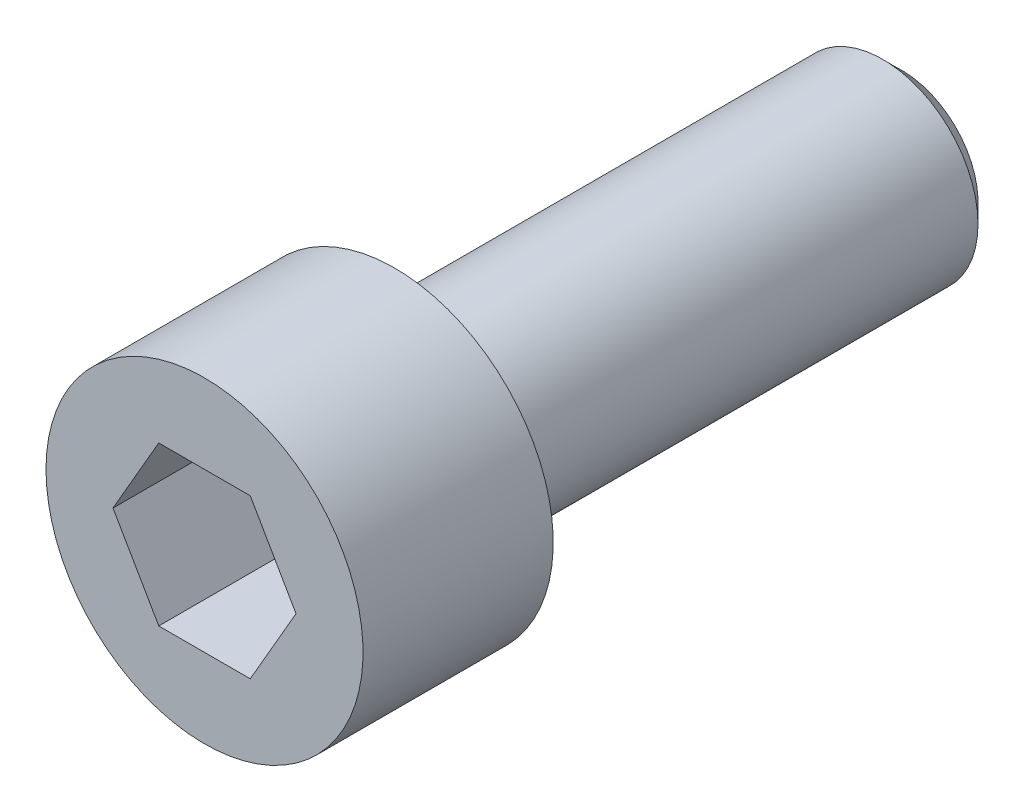
ISO-10303-21;
HEADER;
FILE_DESCRIPTION(('STEP AP214'),'2;1');
FILE_NAME('part.step','',(''),(''),'','','');
FILE_SCHEMA(('AUTOMOTIVE_DESIGN { 1 0 10303 214 1 1 1 1 }'));
ENDSEC;
DATA;
#1=APPLICATION_CONTEXT('core data for automotive mechanical design processes');
#2=APPLICATION_PROTOCOL_DEFINITION('international standard','automotive_design',2000,#1);
#3=PRODUCT_CONTEXT('',#1,'mechanical');
#4=PRODUCT('Part','Part','',(#3));
#5=PRODUCT_RELATED_PRODUCT_CATEGORY('part','',(#4));
#6=PRODUCT_DEFINITION_FORMATION('','',#4);
#7=PRODUCT_DEFINITION_CONTEXT('part definition',#1,'design');
#8=PRODUCT_DEFINITION('design','',#6,#7);
#9=PRODUCT_DEFINITION_SHAPE('','',#8);
#10=(LENGTH_UNIT() NAMED_UNIT(*) SI_UNIT(.MILLI.,.METRE.));
#11=(NAMED_UNIT(*) PLANE_ANGLE_UNIT() SI_UNIT($,.RADIAN.));
#12=(NAMED_UNIT(*) SI_UNIT($,.STERADIAN.) SOLID_ANGLE_UNIT());
#13=UNCERTAINTY_MEASURE_WITH_UNIT(LENGTH_MEASURE(1.E-05),#10,'distance_accuracy_value','');
#14=(GEOMETRIC_REPRESENTATION_CONTEXT(3) GLOBAL_UNCERTAINTY_ASSIGNED_CONTEXT((#13)) GLOBAL_UNIT_ASSIGNED_CONTEXT((#10,
#11,#12)) REPRESENTATION_CONTEXT('',''));
#15=CARTESIAN_POINT('',(0.,0.,0.));
#16=DIRECTION('',(0.,0.,1.));
#17=DIRECTION('',(1.,0.,0.));
#18=AXIS2_PLACEMENT_3D('',#15,#16,#17);
#19=CARTESIAN_POINT('',(0.,0.,0.));
#20=DIRECTION('',(0.,0.,1.));
#21=DIRECTION('',(1.,0.,0.));
#22=AXIS2_PLACEMENT_3D('',#19,#20,#21);
#23=PLANE('',#22);
#24=DIRECTION('',(0.5,0.866025403784439,0.));
#25=VECTOR('',#24,1.);
#26=CARTESIAN_POINT('',(0.721687836487033,-1.25,0.));
#27=LINE('',#26,#25);
#28=CARTESIAN_POINT('',(0.721687836487033,-1.25,0.));
#29=VERTEX_POINT('',#28);
#30=CARTESIAN_POINT('',(1.44337567297407,0.,0.));
#31=VERTEX_POINT('',#30);
#32=EDGE_CURVE('E50',#29,#31,#27,.T.);
#33=ORIENTED_EDGE('',*,*,#32,.F.);
#34=DIRECTION('',(1.,0.,0.));
#35=VECTOR('',#34,1.);
#36=CARTESIAN_POINT('',(-0.721687836487032,-1.25,0.));
#37=LINE('',#36,#35);
#38=CARTESIAN_POINT('',(-0.721687836487032,-1.25,0.));
#39=VERTEX_POINT('',#38);
#40=EDGE_CURVE('E133',#39,#29,#37,.T.);
#41=ORIENTED_EDGE('',*,*,#40,.F.);
#42=DIRECTION('',(0.5,-0.866025403784439,0.));
#43=VECTOR('',#42,1.);
#44=CARTESIAN_POINT('',(-1.44337567297406,0.,0.));
#45=LINE('',#44,#43);
#46=CARTESIAN_POINT('',(-1.44337567297406,0.,0.));
#47=VERTEX_POINT('',#46);
#48=EDGE_CURVE('E131',#47,#39,#45,.T.);
#49=ORIENTED_EDGE('',*,*,#48,.F.);
#50=DIRECTION('',(-0.5,-0.866025403784439,0.));
#51=VECTOR('',#50,1.);
#52=CARTESIAN_POINT('',(-0.721687836487032,1.25,0.));
#53=LINE('',#52,#51);
#54=CARTESIAN_POINT('',(-0.721687836487032,1.25,0.));
#55=VERTEX_POINT('',#54);
#56=EDGE_CURVE('E98',#55,#47,#53,.T.);
#57=ORIENTED_EDGE('',*,*,#56,.F.);
#58=DIRECTION('',(-1.,0.,0.));
#59=VECTOR('',#58,1.);
#60=CARTESIAN_POINT('',(0.721687836487032,1.25,0.));
#61=LINE('',#60,#59);
#62=CARTESIAN_POINT('',(0.721687836487032,1.25,0.));
#63=VERTEX_POINT('',#62);
#64=EDGE_CURVE('E127',#63,#55,#61,.T.);
#65=ORIENTED_EDGE('',*,*,#64,.F.);
#66=DIRECTION('',(-0.5,0.866025403784438,0.));
#67=VECTOR('',#66,1.);
#68=CARTESIAN_POINT('',(1.44337567297407,0.,0.));
#69=LINE('',#68,#67);
#70=EDGE_CURVE('E124',#31,#63,#69,.T.);
#71=ORIENTED_EDGE('',*,*,#70,.F.);
#72=EDGE_LOOP('',(#33,#41,#49,#57,#65,#71));
#73=FACE_BOUND('',#72,.T.);
#74=CARTESIAN_POINT('',(0.,0.,0.));
#75=DIRECTION('',(0.,0.,-1.));
#76=DIRECTION('',(-1.,0.,0.));
#77=AXIS2_PLACEMENT_3D('',#74,#75,#76);
#78=CIRCLE('',#77,2.5);
#79=CARTESIAN_POINT('',(-2.5,0.,0.));
#80=VERTEX_POINT('',#79);
#81=EDGE_CURVE('E145',#80,#80,#78,.T.);
#82=ORIENTED_EDGE('',*,*,#81,.F.);
#83=EDGE_LOOP('',(#82));
#84=FACE_BOUND('',#83,.T.);
#85=ADVANCED_FACE('F35',(#73,#84),#23,.T.);
#86=CARTESIAN_POINT('',(0.,0.,0.));
#87=DIRECTION('',(0.,0.,-1.));
#88=DIRECTION('',(-1.,0.,0.));
#89=AXIS2_PLACEMENT_3D('',#86,#87,#88);
#90=CYLINDRICAL_SURFACE('',#89,2.5);
#91=ORIENTED_EDGE('',*,*,#81,.T.);
#92=EDGE_LOOP('',(#91));
#93=FACE_BOUND('',#92,.T.);
#94=CARTESIAN_POINT('',(0.,0.,-3.));
#95=DIRECTION('',(0.,0.,-1.));
#96=DIRECTION('',(-1.,0.,0.));
#97=AXIS2_PLACEMENT_3D('',#94,#95,#96);
#98=CIRCLE('',#97,2.5);
#99=CARTESIAN_POINT('',(-2.5,0.,-3.));
#100=VERTEX_POINT('',#99);
#101=EDGE_CURVE('E137',#100,#100,#98,.T.);
#102=ORIENTED_EDGE('',*,*,#101,.F.);
#103=EDGE_LOOP('',(#102));
#104=FACE_BOUND('',#103,.T.);
#105=ADVANCED_FACE('F167',(#93,#104),#90,.T.);
#106=CARTESIAN_POINT('',(0.,2.5,-3.));
#107=DIRECTION('',(0.,0.,-1.));
#108=DIRECTION('',(-1.,0.,0.));
#109=AXIS2_PLACEMENT_3D('',#106,#107,#108);
#110=PLANE('',#109);
#111=CARTESIAN_POINT('',(0.,0.,-3.));
#112=DIRECTION('',(0.,0.,-1.));
#113=DIRECTION('',(-1.,0.,0.));
#114=AXIS2_PLACEMENT_3D('',#111,#112,#113);
#115=CIRCLE('',#114,1.8);
#116=CARTESIAN_POINT('',(-1.8,0.,-3.));
#117=VERTEX_POINT('',#116);
#118=EDGE_CURVE('E151',#117,#117,#115,.F.);
#119=ORIENTED_EDGE('',*,*,#118,.T.);
#120=EDGE_LOOP('',(#119));
#121=FACE_BOUND('',#120,.T.);
#122=ORIENTED_EDGE('',*,*,#101,.T.);
#123=EDGE_LOOP('',(#122));
#124=FACE_BOUND('',#123,.T.);
#125=ADVANCED_FACE('F173',(#121,#124),#110,.T.);
#126=CARTESIAN_POINT('',(0.,0.,0.));
#127=DIRECTION('',(0.,0.,-1.));
#128=DIRECTION('',(-1.,0.,0.));
#129=AXIS2_PLACEMENT_3D('',#126,#127,#128);
#130=CYLINDRICAL_SURFACE('',#129,1.5);
#131=CARTESIAN_POINT('',(0.,0.,-10.7));
#132=DIRECTION('',(0.,0.,-1.));
#133=DIRECTION('',(-1.,0.,0.));
#134=AXIS2_PLACEMENT_3D('',#131,#132,#133);
#135=CIRCLE('',#134,1.5);
#136=CARTESIAN_POINT('',(-1.5,0.,-10.7));
#137=VERTEX_POINT('',#136);
#138=EDGE_CURVE('E11',#137,#137,#135,.F.);
#139=ORIENTED_EDGE('',*,*,#138,.T.);
#140=EDGE_LOOP('',(#139));
#141=FACE_BOUND('',#140,.T.);
#142=CARTESIAN_POINT('',(0.,0.,-3.3));
#143=DIRECTION('',(0.,0.,-1.));
#144=DIRECTION('',(-1.,0.,0.));
#145=AXIS2_PLACEMENT_3D('',#142,#143,#144);
#146=CIRCLE('',#145,1.5);
#147=CARTESIAN_POINT('',(-1.5,0.,-3.3));
#148=VERTEX_POINT('',#147);
#149=EDGE_CURVE('E148',#148,#148,#146,.T.);
#150=ORIENTED_EDGE('',*,*,#149,.T.);
#151=EDGE_LOOP('',(#150));
#152=FACE_BOUND('',#151,.T.);
#153=ADVANCED_FACE('F180',(#141,#152),#130,.T.);
#154=CARTESIAN_POINT('',(0.,1.5,-11.));
#155=DIRECTION('',(0.,0.,-1.));
#156=DIRECTION('',(-1.,0.,0.));
#157=AXIS2_PLACEMENT_3D('',#154,#155,#156);
#158=PLANE('',#157);
#159=CARTESIAN_POINT('',(0.,0.,-11.));
#160=DIRECTION('',(0.,0.,-1.));
#161=DIRECTION('',(-1.,0.,0.));
#162=AXIS2_PLACEMENT_3D('',#159,#160,#161);
#163=CIRCLE('',#162,1.2);
#164=CARTESIAN_POINT('',(-1.2,0.,-11.));
#165=VERTEX_POINT('',#164);
#166=EDGE_CURVE('E43',#165,#165,#163,.T.);
#167=ORIENTED_EDGE('',*,*,#166,.T.);
#168=EDGE_LOOP('',(#167));
#169=FACE_BOUND('',#168,.T.);
#170=ADVANCED_FACE('F156',(#169),#158,.T.);
#171=CARTESIAN_POINT('',(0.721687836487033,-1.25,-2.));
#172=DIRECTION('',(0.866025403784439,-0.5,0.));
#173=DIRECTION('',(0.5,0.866025403784439,0.));
#174=AXIS2_PLACEMENT_3D('',#171,#172,#173);
#175=PLANE('',#174);
#176=ORIENTED_EDGE('',*,*,#32,.T.);
#177=DIRECTION('',(0.,0.,1.));
#178=VECTOR('',#177,1.);
#179=CARTESIAN_POINT('',(1.44337567297407,0.,-2.));
#180=LINE('',#179,#178);
#181=CARTESIAN_POINT('',(1.44337567297407,0.,-2.));
#182=VERTEX_POINT('',#181);
#183=EDGE_CURVE('E80',#182,#31,#180,.T.);
#184=ORIENTED_EDGE('',*,*,#183,.F.);
#185=DIRECTION('',(0.5,0.866025403784439,0.));
#186=VECTOR('',#185,1.);
#187=CARTESIAN_POINT('',(0.721687836487033,-1.25,-2.));
#188=LINE('',#187,#186);
#189=CARTESIAN_POINT('',(0.721687836487033,-1.25,-2.));
#190=VERTEX_POINT('',#189);
#191=EDGE_CURVE('E135',#190,#182,#188,.T.);
#192=ORIENTED_EDGE('',*,*,#191,.F.);
#193=DIRECTION('',(0.,0.,1.));
#194=VECTOR('',#193,1.);
#195=CARTESIAN_POINT('',(0.721687836487033,-1.25,-2.));
#196=LINE('',#195,#194);
#197=EDGE_CURVE('E58',#190,#29,#196,.T.);
#198=ORIENTED_EDGE('',*,*,#197,.T.);
#199=EDGE_LOOP('',(#176,#184,#192,#198));
#200=FACE_BOUND('',#199,.T.);
#201=ADVANCED_FACE('F187',(#200),#175,.F.);
#202=CARTESIAN_POINT('',(-0.721687836487032,-1.25,-2.));
#203=DIRECTION('',(0.,-1.,0.));
#204=DIRECTION('',(0.,0.,-1.));
#205=AXIS2_PLACEMENT_3D('',#202,#203,#204);
#206=PLANE('',#205);
#207=ORIENTED_EDGE('',*,*,#40,.T.);
#208=ORIENTED_EDGE('',*,*,#197,.F.);
#209=DIRECTION('',(1.,0.,0.));
#210=VECTOR('',#209,1.);
#211=CARTESIAN_POINT('',(-0.721687836487032,-1.25,-2.));
#212=LINE('',#211,#210);
#213=CARTESIAN_POINT('',(-0.721687836487032,-1.25,-2.));
#214=VERTEX_POINT('',#213);
#215=EDGE_CURVE('E110',#214,#190,#212,.T.);
#216=ORIENTED_EDGE('',*,*,#215,.F.);
#217=DIRECTION('',(0.,0.,1.));
#218=VECTOR('',#217,1.);
#219=CARTESIAN_POINT('',(-0.721687836487032,-1.25,-2.));
#220=LINE('',#219,#218);
#221=EDGE_CURVE('E102',#214,#39,#220,.T.);
#222=ORIENTED_EDGE('',*,*,#221,.T.);
#223=EDGE_LOOP('',(#207,#208,#216,#222));
#224=FACE_BOUND('',#223,.T.);
#225=ADVANCED_FACE('F190',(#224),#206,.F.);
#226=CARTESIAN_POINT('',(-1.44337567297406,0.,-2.));
#227=DIRECTION('',(-0.866025403784439,-0.5,0.));
#228=DIRECTION('',(0.5,-0.866025403784439,0.));
#229=AXIS2_PLACEMENT_3D('',#226,#227,#228);
#230=PLANE('',#229);
#231=ORIENTED_EDGE('',*,*,#48,.T.);
#232=ORIENTED_EDGE('',*,*,#221,.F.);
#233=DIRECTION('',(0.5,-0.866025403784439,0.));
#234=VECTOR('',#233,1.);
#235=CARTESIAN_POINT('',(-1.44337567297406,0.,-2.));
#236=LINE('',#235,#234);
#237=CARTESIAN_POINT('',(-1.44337567297406,0.,-2.));
#238=VERTEX_POINT('',#237);
#239=EDGE_CURVE('E106',#238,#214,#236,.T.);
#240=ORIENTED_EDGE('',*,*,#239,.F.);
#241=DIRECTION('',(0.,0.,1.));
#242=VECTOR('',#241,1.);
#243=CARTESIAN_POINT('',(-1.44337567297406,0.,-2.));
#244=LINE('',#243,#242);
#245=EDGE_CURVE('E91',#238,#47,#244,.T.);
#246=ORIENTED_EDGE('',*,*,#245,.T.);
#247=EDGE_LOOP('',(#231,#232,#240,#246));
#248=FACE_BOUND('',#247,.T.);
#249=ADVANCED_FACE('F107',(#248),#230,.F.);
#250=CARTESIAN_POINT('',(-0.721687836487032,1.25,-2.));
#251=DIRECTION('',(-0.866025403784439,0.5,0.));
#252=DIRECTION('',(-0.5,-0.866025403784439,0.));
#253=AXIS2_PLACEMENT_3D('',#250,#251,#252);
#254=PLANE('',#253);
#255=ORIENTED_EDGE('',*,*,#56,.T.);
#256=ORIENTED_EDGE('',*,*,#245,.F.);
#257=DIRECTION('',(-0.5,-0.866025403784439,0.));
#258=VECTOR('',#257,1.);
#259=CARTESIAN_POINT('',(-0.721687836487032,1.25,-2.));
#260=LINE('',#259,#258);
#261=CARTESIAN_POINT('',(-0.721687836487032,1.25,-2.));
#262=VERTEX_POINT('',#261);
#263=EDGE_CURVE('E95',#262,#238,#260,.T.);
#264=ORIENTED_EDGE('',*,*,#263,.F.);
#265=DIRECTION('',(0.,0.,1.));
#266=VECTOR('',#265,1.);
#267=CARTESIAN_POINT('',(-0.721687836487032,1.25,-2.));
#268=LINE('',#267,#266);
#269=EDGE_CURVE('E103',#262,#55,#268,.T.);
#270=ORIENTED_EDGE('',*,*,#269,.T.);
#271=EDGE_LOOP('',(#255,#256,#264,#270));
#272=FACE_BOUND('',#271,.T.);
#273=ADVANCED_FACE('F93',(#272),#254,.F.);
#274=CARTESIAN_POINT('',(0.721687836487032,1.25,-2.));
#275=DIRECTION('',(0.,1.,0.));
#276=DIRECTION('',(0.,0.,1.));
#277=AXIS2_PLACEMENT_3D('',#274,#275,#276);
#278=PLANE('',#277);
#279=ORIENTED_EDGE('',*,*,#64,.T.);
#280=ORIENTED_EDGE('',*,*,#269,.F.);
#281=DIRECTION('',(-1.,0.,0.));
#282=VECTOR('',#281,1.);
#283=CARTESIAN_POINT('',(0.721687836487032,1.25,-2.));
#284=LINE('',#283,#282);
#285=CARTESIAN_POINT('',(0.721687836487032,1.25,-2.));
#286=VERTEX_POINT('',#285);
#287=EDGE_CURVE('E116',#286,#262,#284,.T.);
#288=ORIENTED_EDGE('',*,*,#287,.F.);
#289=DIRECTION('',(0.,0.,1.));
#290=VECTOR('',#289,1.);
#291=CARTESIAN_POINT('',(0.721687836487032,1.25,-2.));
#292=LINE('',#291,#290);
#293=EDGE_CURVE('E140',#286,#63,#292,.T.);
#294=ORIENTED_EDGE('',*,*,#293,.T.);
#295=EDGE_LOOP('',(#279,#280,#288,#294));
#296=FACE_BOUND('',#295,.T.);
#297=ADVANCED_FACE('F194',(#296),#278,.F.);
#298=CARTESIAN_POINT('',(1.44337567297407,0.,-2.));
#299=DIRECTION('',(0.866025403784438,0.5,0.));
#300=DIRECTION('',(-0.5,0.866025403784438,0.));
#301=AXIS2_PLACEMENT_3D('',#298,#299,#300);
#302=PLANE('',#301);
#303=ORIENTED_EDGE('',*,*,#70,.T.);
#304=ORIENTED_EDGE('',*,*,#293,.F.);
#305=DIRECTION('',(-0.5,0.866025403784438,0.));
#306=VECTOR('',#305,1.);
#307=CARTESIAN_POINT('',(1.44337567297407,0.,-2.));
#308=LINE('',#307,#306);
#309=EDGE_CURVE('E118',#182,#286,#308,.T.);
#310=ORIENTED_EDGE('',*,*,#309,.F.);
#311=ORIENTED_EDGE('',*,*,#183,.T.);
#312=EDGE_LOOP('',(#303,#304,#310,#311));
#313=FACE_BOUND('',#312,.T.);
#314=ADVANCED_FACE('F191',(#313),#302,.F.);
#315=CARTESIAN_POINT('',(0.,0.,-2.));
#316=DIRECTION('',(0.,0.,1.));
#317=DIRECTION('',(1.,0.,0.));
#318=AXIS2_PLACEMENT_3D('',#315,#316,#317);
#319=PLANE('',#318);
#320=ORIENTED_EDGE('',*,*,#191,.T.);
#321=ORIENTED_EDGE('',*,*,#309,.T.);
#322=ORIENTED_EDGE('',*,*,#287,.T.);
#323=ORIENTED_EDGE('',*,*,#263,.T.);
#324=ORIENTED_EDGE('',*,*,#239,.T.);
#325=ORIENTED_EDGE('',*,*,#215,.T.);
#326=EDGE_LOOP('',(#320,#321,#322,#323,#324,#325));
#327=FACE_BOUND('',#326,.T.);
#328=ADVANCED_FACE('F113',(#327),#319,.T.);
#329=CARTESIAN_POINT('',(0.,0.,-3.3));
#330=DIRECTION('',(0.,0.,-1.));
#331=DIRECTION('',(-1.,0.,0.));
#332=AXIS2_PLACEMENT_3D('',#329,#330,#331);
#333=TOROIDAL_SURFACE('',#332,1.8,0.3);
#334=ORIENTED_EDGE('',*,*,#118,.F.);
#335=EDGE_LOOP('',(#334));
#336=FACE_BOUND('',#335,.T.);
#337=ORIENTED_EDGE('',*,*,#149,.F.);
#338=EDGE_LOOP('',(#337));
#339=FACE_BOUND('',#338,.T.);
#340=ADVANCED_FACE('F159',(#336,#339),#333,.F.);
#341=CARTESIAN_POINT('',(0.,0.,-11.));
#342=DIRECTION('',(0.,0.,1.));
#343=DIRECTION('',(1.,0.,0.));
#344=AXIS2_PLACEMENT_3D('',#341,#342,#343);
#345=CONICAL_SURFACE('',#344,1.2,0.785398163397447);
#346=ORIENTED_EDGE('',*,*,#138,.F.);
#347=EDGE_LOOP('',(#346));
#348=FACE_BOUND('',#347,.T.);
#349=ORIENTED_EDGE('',*,*,#166,.F.);
#350=EDGE_LOOP('',(#349));
#351=FACE_BOUND('',#350,.T.);
#352=ADVANCED_FACE('F37',(#348,#351),#345,.T.);
#353=CLOSED_SHELL('',(#85,#105,#125,#153,#170,#201,#225,#249,#273,#297,#314,#328,#340,#352));
#354=MANIFOLD_SOLID_BREP('B2',#353);
#355=ADVANCED_BREP_SHAPE_REPRESENTATION('',(#18,#354),#14);
#356=SHAPE_DEFINITION_REPRESENTATION(#9,#355);
ENDSEC;
END-ISO-10303-21;
